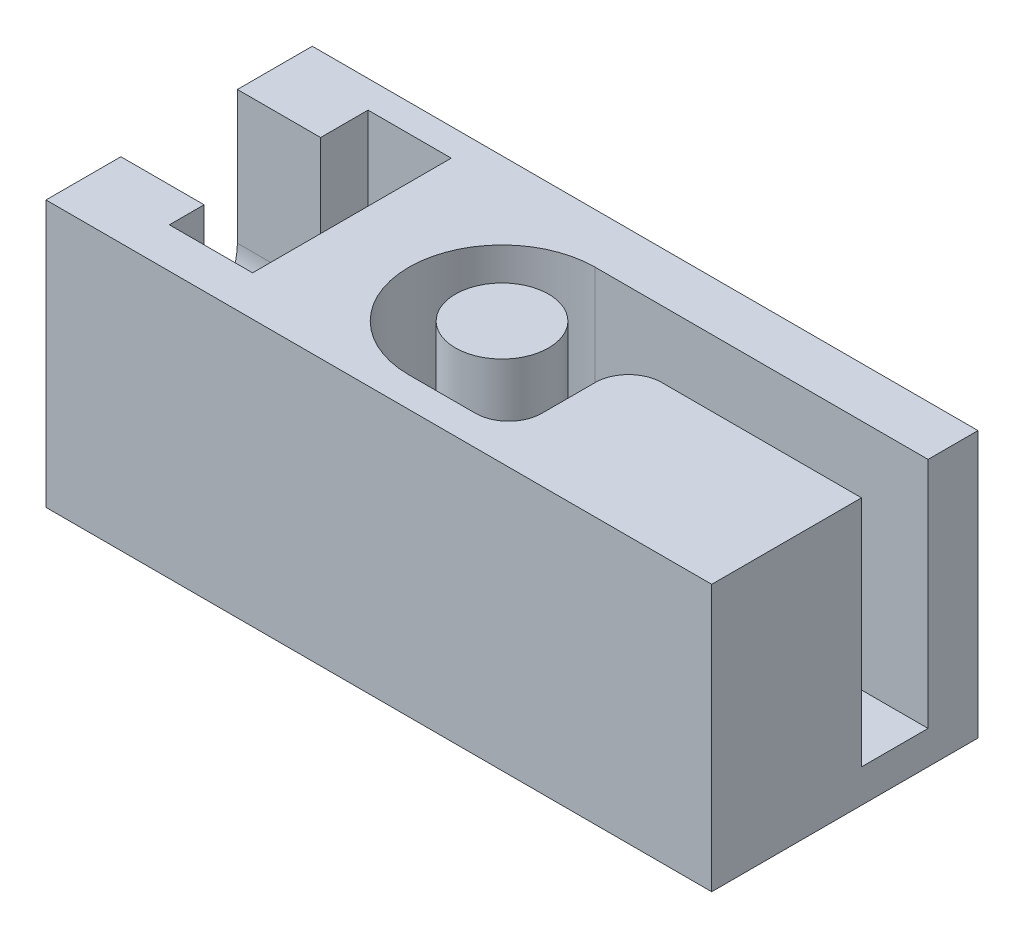
ISO-10303-21;
HEADER;
FILE_DESCRIPTION(('STEP AP214'),'2;1');
FILE_NAME('part.step','',(''),(''),'','','');
FILE_SCHEMA(('AUTOMOTIVE_DESIGN { 1 0 10303 214 1 1 1 1 }'));
ENDSEC;
DATA;
#1=APPLICATION_CONTEXT('core data for automotive mechanical design processes');
#2=APPLICATION_PROTOCOL_DEFINITION('international standard','automotive_design',2000,#1);
#3=PRODUCT_CONTEXT('',#1,'mechanical');
#4=PRODUCT('Part','Part','',(#3));
#5=PRODUCT_RELATED_PRODUCT_CATEGORY('part','',(#4));
#6=PRODUCT_DEFINITION_FORMATION('','',#4);
#7=PRODUCT_DEFINITION_CONTEXT('part definition',#1,'design');
#8=PRODUCT_DEFINITION('design','',#6,#7);
#9=PRODUCT_DEFINITION_SHAPE('','',#8);
#10=(LENGTH_UNIT() NAMED_UNIT(*) SI_UNIT(.MILLI.,.METRE.));
#11=(NAMED_UNIT(*) PLANE_ANGLE_UNIT() SI_UNIT($,.RADIAN.));
#12=(NAMED_UNIT(*) SI_UNIT($,.STERADIAN.) SOLID_ANGLE_UNIT());
#13=UNCERTAINTY_MEASURE_WITH_UNIT(LENGTH_MEASURE(1.E-05),#10,'distance_accuracy_value','');
#14=(GEOMETRIC_REPRESENTATION_CONTEXT(3) GLOBAL_UNCERTAINTY_ASSIGNED_CONTEXT((#13)) GLOBAL_UNIT_ASSIGNED_CONTEXT((#10,
#11,#12)) REPRESENTATION_CONTEXT('',''));
#15=CARTESIAN_POINT('',(0.,0.,0.));
#16=DIRECTION('',(0.,0.,1.));
#17=DIRECTION('',(1.,0.,0.));
#18=AXIS2_PLACEMENT_3D('',#15,#16,#17);
#19=CARTESIAN_POINT('',(0.,8.,0.));
#20=DIRECTION('',(0.,-1.,0.));
#21=DIRECTION('',(0.,0.,-1.));
#22=AXIS2_PLACEMENT_3D('',#19,#20,#21);
#23=PLANE('',#22);
#24=DIRECTION('',(0.,0.,1.));
#25=VECTOR('',#24,1.);
#26=CARTESIAN_POINT('',(2.5,8.,0.));
#27=LINE('',#26,#25);
#28=CARTESIAN_POINT('',(2.5,8.,-7.17542648054294));
#29=VERTEX_POINT('',#28);
#30=CARTESIAN_POINT('',(2.5,8.,-5.75));
#31=VERTEX_POINT('',#30);
#32=EDGE_CURVE('E244',#29,#31,#27,.T.);
#33=ORIENTED_EDGE('',*,*,#32,.F.);
#34=DIRECTION('',(-1.,0.,0.));
#35=VECTOR('',#34,1.);
#36=CARTESIAN_POINT('',(0.,8.,-7.17542648054294));
#37=LINE('',#36,#35);
#38=CARTESIAN_POINT('',(5.,8.,-7.17542648054294));
#39=VERTEX_POINT('',#38);
#40=EDGE_CURVE('E11',#39,#29,#37,.T.);
#41=ORIENTED_EDGE('',*,*,#40,.F.);
#42=DIRECTION('',(0.,0.,-1.));
#43=VECTOR('',#42,1.);
#44=CARTESIAN_POINT('',(5.,8.,-5.75));
#45=LINE('',#44,#43);
#46=CARTESIAN_POINT('',(5.,8.,-1.20676920104996));
#47=VERTEX_POINT('',#46);
#48=EDGE_CURVE('E246',#47,#39,#45,.T.);
#49=ORIENTED_EDGE('',*,*,#48,.F.);
#50=DIRECTION('',(1.,0.,0.));
#51=VECTOR('',#50,1.);
#52=CARTESIAN_POINT('',(0.,8.,-1.20676920104996));
#53=LINE('',#52,#51);
#54=CARTESIAN_POINT('',(2.5,8.,-1.20676920104996));
#55=VERTEX_POINT('',#54);
#56=EDGE_CURVE('E41',#55,#47,#53,.T.);
#57=ORIENTED_EDGE('',*,*,#56,.F.);
#58=CARTESIAN_POINT('',(2.5,8.,-2.25));
#59=VERTEX_POINT('',#58);
#60=EDGE_CURVE('E241',#59,#55,#27,.T.);
#61=ORIENTED_EDGE('',*,*,#60,.F.);
#62=DIRECTION('',(-1.,0.,0.));
#63=VECTOR('',#62,1.);
#64=CARTESIAN_POINT('',(5.,8.,-2.25));
#65=LINE('',#64,#63);
#66=CARTESIAN_POINT('',(0.,8.,-2.25));
#67=VERTEX_POINT('',#66);
#68=EDGE_CURVE('E263',#59,#67,#65,.T.);
#69=ORIENTED_EDGE('',*,*,#68,.T.);
#70=DIRECTION('',(0.,0.,1.));
#71=VECTOR('',#70,1.);
#72=CARTESIAN_POINT('',(0.,8.,0.));
#73=LINE('',#72,#71);
#74=CARTESIAN_POINT('',(0.,8.,0.));
#75=VERTEX_POINT('',#74);
#76=EDGE_CURVE('E85',#67,#75,#73,.T.);
#77=ORIENTED_EDGE('',*,*,#76,.T.);
#78=DIRECTION('',(1.,0.,0.));
#79=VECTOR('',#78,1.);
#80=CARTESIAN_POINT('',(0.,8.,0.));
#81=LINE('',#80,#79);
#82=CARTESIAN_POINT('',(20.,8.,0.));
#83=VERTEX_POINT('',#82);
#84=EDGE_CURVE('E333',#75,#83,#81,.T.);
#85=ORIENTED_EDGE('',*,*,#84,.T.);
#86=DIRECTION('',(0.,0.,-1.));
#87=VECTOR('',#86,1.);
#88=CARTESIAN_POINT('',(20.,8.,0.));
#89=LINE('',#88,#87);
#90=CARTESIAN_POINT('',(20.,8.,-4.5));
#91=VERTEX_POINT('',#90);
#92=EDGE_CURVE('E336',#83,#91,#89,.T.);
#93=ORIENTED_EDGE('',*,*,#92,.T.);
#94=DIRECTION('',(1.,0.,0.));
#95=VECTOR('',#94,1.);
#96=CARTESIAN_POINT('',(14.,8.,-4.5));
#97=LINE('',#96,#95);
#98=CARTESIAN_POINT('',(14.,8.,-4.5));
#99=VERTEX_POINT('',#98);
#100=EDGE_CURVE('E276',#99,#91,#97,.T.);
#101=ORIENTED_EDGE('',*,*,#100,.F.);
#102=CARTESIAN_POINT('',(14.,8.,-3.5));
#103=DIRECTION('',(0.,-1.,0.));
#104=DIRECTION('',(0.,0.,-1.));
#105=AXIS2_PLACEMENT_3D('',#102,#103,#104);
#106=CIRCLE('',#105,1.);
#107=CARTESIAN_POINT('',(13.,8.,-3.5));
#108=VERTEX_POINT('',#107);
#109=EDGE_CURVE('E310',#108,#99,#106,.T.);
#110=ORIENTED_EDGE('',*,*,#109,.F.);
#111=DIRECTION('',(0.,0.,-1.));
#112=VECTOR('',#111,1.);
#113=CARTESIAN_POINT('',(13.,8.,-1.9));
#114=LINE('',#113,#112);
#115=CARTESIAN_POINT('',(13.,8.,-1.9));
#116=VERTEX_POINT('',#115);
#117=EDGE_CURVE('E307',#116,#108,#114,.T.);
#118=ORIENTED_EDGE('',*,*,#117,.F.);
#119=CARTESIAN_POINT('',(12.,8.,-1.9));
#120=DIRECTION('',(0.,1.,0.));
#121=DIRECTION('',(0.,0.,1.));
#122=AXIS2_PLACEMENT_3D('',#119,#120,#121);
#123=CIRCLE('',#122,1.);
#124=CARTESIAN_POINT('',(12.,8.,-0.899999999999999));
#125=VERTEX_POINT('',#124);
#126=EDGE_CURVE('E304',#125,#116,#123,.T.);
#127=ORIENTED_EDGE('',*,*,#126,.F.);
#128=DIRECTION('',(1.,0.,0.));
#129=VECTOR('',#128,1.);
#130=CARTESIAN_POINT('',(10.,8.,-0.899999999999999));
#131=LINE('',#130,#129);
#132=CARTESIAN_POINT('',(10.,8.,-0.9));
#133=VERTEX_POINT('',#132);
#134=EDGE_CURVE('E301',#133,#125,#131,.T.);
#135=ORIENTED_EDGE('',*,*,#134,.F.);
#136=CARTESIAN_POINT('',(10.,8.,-3.7));
#137=DIRECTION('',(0.,1.,0.));
#138=DIRECTION('',(0.,0.,1.));
#139=AXIS2_PLACEMENT_3D('',#136,#137,#138);
#140=CIRCLE('',#139,2.8);
#141=CARTESIAN_POINT('',(10.,8.,-6.5));
#142=VERTEX_POINT('',#141);
#143=EDGE_CURVE('E298',#142,#133,#140,.T.);
#144=ORIENTED_EDGE('',*,*,#143,.F.);
#145=DIRECTION('',(-1.,0.,0.));
#146=VECTOR('',#145,1.);
#147=CARTESIAN_POINT('',(20.,8.,-6.5));
#148=LINE('',#147,#146);
#149=CARTESIAN_POINT('',(20.,8.,-6.5));
#150=VERTEX_POINT('',#149);
#151=EDGE_CURVE('E269',#150,#142,#148,.T.);
#152=ORIENTED_EDGE('',*,*,#151,.F.);
#153=CARTESIAN_POINT('',(20.,8.,-8.));
#154=VERTEX_POINT('',#153);
#155=EDGE_CURVE('E335',#150,#154,#89,.T.);
#156=ORIENTED_EDGE('',*,*,#155,.T.);
#157=DIRECTION('',(-1.,0.,0.));
#158=VECTOR('',#157,1.);
#159=CARTESIAN_POINT('',(0.,8.,-8.));
#160=LINE('',#159,#158);
#161=CARTESIAN_POINT('',(0.,8.,-8.));
#162=VERTEX_POINT('',#161);
#163=EDGE_CURVE('E57',#154,#162,#160,.T.);
#164=ORIENTED_EDGE('',*,*,#163,.T.);
#165=CARTESIAN_POINT('',(0.,8.,-5.75));
#166=VERTEX_POINT('',#165);
#167=EDGE_CURVE('E331',#162,#166,#73,.T.);
#168=ORIENTED_EDGE('',*,*,#167,.T.);
#169=DIRECTION('',(-1.,0.,0.));
#170=VECTOR('',#169,1.);
#171=CARTESIAN_POINT('',(5.,8.,-5.75));
#172=LINE('',#171,#170);
#173=EDGE_CURVE('E261',#31,#166,#172,.T.);
#174=ORIENTED_EDGE('',*,*,#173,.F.);
#175=EDGE_LOOP('',(#33,#41,#49,#57,#61,#69,#77,#85,#93,#101,#110,#118,#127,#135,#144,#152,#156,
#164,#168,#174));
#176=FACE_BOUND('',#175,.T.);
#177=ADVANCED_FACE('F33',(#176),#23,.F.);
#178=CARTESIAN_POINT('',(5.,4.,-4.));
#179=DIRECTION('',(-1.,0.,0.));
#180=DIRECTION('',(0.,0.,1.));
#181=AXIS2_PLACEMENT_3D('',#178,#179,#180);
#182=CYLINDRICAL_SURFACE('',#181,1.75);
#183=CARTESIAN_POINT('',(2.5,4.,-4.));
#184=DIRECTION('',(1.,0.,0.));
#185=DIRECTION('',(0.,0.,-1.));
#186=AXIS2_PLACEMENT_3D('',#183,#184,#185);
#187=CIRCLE('',#186,1.75);
#188=CARTESIAN_POINT('',(2.5,4.,-5.75));
#189=VERTEX_POINT('',#188);
#190=CARTESIAN_POINT('',(2.5,4.,-2.25));
#191=VERTEX_POINT('',#190);
#192=EDGE_CURVE('E209',#189,#191,#187,.F.);
#193=ORIENTED_EDGE('',*,*,#192,.F.);
#194=DIRECTION('',(-1.,0.,0.));
#195=VECTOR('',#194,1.);
#196=CARTESIAN_POINT('',(5.,4.,-5.75));
#197=LINE('',#196,#195);
#198=CARTESIAN_POINT('',(0.,4.,-5.75));
#199=VERTEX_POINT('',#198);
#200=EDGE_CURVE('E258',#189,#199,#197,.T.);
#201=ORIENTED_EDGE('',*,*,#200,.T.);
#202=CARTESIAN_POINT('',(0.,4.,-4.));
#203=DIRECTION('',(-1.,0.,0.));
#204=DIRECTION('',(0.,0.,1.));
#205=AXIS2_PLACEMENT_3D('',#202,#203,#204);
#206=CIRCLE('',#205,1.75);
#207=CARTESIAN_POINT('',(0.,4.,-2.25));
#208=VERTEX_POINT('',#207);
#209=EDGE_CURVE('E250',#199,#208,#206,.T.);
#210=ORIENTED_EDGE('',*,*,#209,.T.);
#211=DIRECTION('',(-1.,0.,0.));
#212=VECTOR('',#211,1.);
#213=CARTESIAN_POINT('',(5.,4.,-2.25));
#214=LINE('',#213,#212);
#215=EDGE_CURVE('E248',#191,#208,#214,.T.);
#216=ORIENTED_EDGE('',*,*,#215,.F.);
#217=EDGE_LOOP('',(#193,#201,#210,#216));
#218=FACE_BOUND('',#217,.T.);
#219=ADVANCED_FACE('F431',(#218),#182,.F.);
#220=CARTESIAN_POINT('',(5.,4.,-5.75));
#221=DIRECTION('',(0.,0.,-1.));
#222=DIRECTION('',(-1.,0.,0.));
#223=AXIS2_PLACEMENT_3D('',#220,#221,#222);
#224=PLANE('',#223);
#225=DIRECTION('',(0.,-1.,0.));
#226=VECTOR('',#225,1.);
#227=CARTESIAN_POINT('',(2.5,4.,-5.75));
#228=LINE('',#227,#226);
#229=EDGE_CURVE('E243',#31,#189,#228,.T.);
#230=ORIENTED_EDGE('',*,*,#229,.F.);
#231=ORIENTED_EDGE('',*,*,#173,.T.);
#232=DIRECTION('',(0.,-1.,0.));
#233=VECTOR('',#232,1.);
#234=CARTESIAN_POINT('',(0.,4.,-5.75));
#235=LINE('',#234,#233);
#236=EDGE_CURVE('E249',#166,#199,#235,.T.);
#237=ORIENTED_EDGE('',*,*,#236,.T.);
#238=ORIENTED_EDGE('',*,*,#200,.F.);
#239=EDGE_LOOP('',(#230,#231,#237,#238));
#240=FACE_BOUND('',#239,.T.);
#241=ADVANCED_FACE('F436',(#240),#224,.F.);
#242=CARTESIAN_POINT('',(5.,8.,-2.25));
#243=DIRECTION('',(0.,0.,1.));
#244=DIRECTION('',(0.,-1.,0.));
#245=AXIS2_PLACEMENT_3D('',#242,#243,#244);
#246=PLANE('',#245);
#247=DIRECTION('',(0.,1.,0.));
#248=VECTOR('',#247,1.);
#249=CARTESIAN_POINT('',(2.5,8.,-2.25));
#250=LINE('',#249,#248);
#251=EDGE_CURVE('E357',#191,#59,#250,.T.);
#252=ORIENTED_EDGE('',*,*,#251,.F.);
#253=ORIENTED_EDGE('',*,*,#215,.T.);
#254=DIRECTION('',(0.,1.,0.));
#255=VECTOR('',#254,1.);
#256=CARTESIAN_POINT('',(0.,8.,-2.25));
#257=LINE('',#256,#255);
#258=EDGE_CURVE('E253',#208,#67,#257,.T.);
#259=ORIENTED_EDGE('',*,*,#258,.T.);
#260=ORIENTED_EDGE('',*,*,#68,.F.);
#261=EDGE_LOOP('',(#252,#253,#259,#260));
#262=FACE_BOUND('',#261,.T.);
#263=ADVANCED_FACE('F376',(#262),#246,.F.);
#264=CARTESIAN_POINT('',(0.,8.,0.));
#265=DIRECTION('',(1.,0.,0.));
#266=DIRECTION('',(0.,0.,-1.));
#267=AXIS2_PLACEMENT_3D('',#264,#265,#266);
#268=PLANE('',#267);
#269=ORIENTED_EDGE('',*,*,#209,.F.);
#270=ORIENTED_EDGE('',*,*,#236,.F.);
#271=ORIENTED_EDGE('',*,*,#167,.F.);
#272=DIRECTION('',(0.,-1.,0.));
#273=VECTOR('',#272,1.);
#274=CARTESIAN_POINT('',(0.,8.,-8.));
#275=LINE('',#274,#273);
#276=CARTESIAN_POINT('',(0.,0.,-8.));
#277=VERTEX_POINT('',#276);
#278=EDGE_CURVE('E340',#162,#277,#275,.T.);
#279=ORIENTED_EDGE('',*,*,#278,.T.);
#280=DIRECTION('',(0.,0.,1.));
#281=VECTOR('',#280,1.);
#282=CARTESIAN_POINT('',(0.,0.,0.));
#283=LINE('',#282,#281);
#284=CARTESIAN_POINT('',(0.,0.,0.));
#285=VERTEX_POINT('',#284);
#286=EDGE_CURVE('E317',#277,#285,#283,.T.);
#287=ORIENTED_EDGE('',*,*,#286,.T.);
#288=DIRECTION('',(0.,-1.,0.));
#289=VECTOR('',#288,1.);
#290=CARTESIAN_POINT('',(0.,8.,0.));
#291=LINE('',#290,#289);
#292=EDGE_CURVE('E354',#75,#285,#291,.T.);
#293=ORIENTED_EDGE('',*,*,#292,.F.);
#294=ORIENTED_EDGE('',*,*,#76,.F.);
#295=ORIENTED_EDGE('',*,*,#258,.F.);
#296=EDGE_LOOP('',(#269,#270,#271,#279,#287,#293,#294,#295));
#297=FACE_BOUND('',#296,.T.);
#298=ADVANCED_FACE('F35',(#297),#268,.F.);
#299=CARTESIAN_POINT('',(0.,8.,0.));
#300=DIRECTION('',(0.,0.,-1.));
#301=DIRECTION('',(-1.,0.,0.));
#302=AXIS2_PLACEMENT_3D('',#299,#300,#301);
#303=PLANE('',#302);
#304=DIRECTION('',(1.,0.,0.));
#305=VECTOR('',#304,1.);
#306=CARTESIAN_POINT('',(0.,0.,0.));
#307=LINE('',#306,#305);
#308=CARTESIAN_POINT('',(20.,0.,0.));
#309=VERTEX_POINT('',#308);
#310=EDGE_CURVE('E343',#285,#309,#307,.T.);
#311=ORIENTED_EDGE('',*,*,#310,.T.);
#312=DIRECTION('',(0.,-1.,0.));
#313=VECTOR('',#312,1.);
#314=CARTESIAN_POINT('',(20.,8.,0.));
#315=LINE('',#314,#313);
#316=EDGE_CURVE('E351',#83,#309,#315,.T.);
#317=ORIENTED_EDGE('',*,*,#316,.F.);
#318=ORIENTED_EDGE('',*,*,#84,.F.);
#319=ORIENTED_EDGE('',*,*,#292,.T.);
#320=EDGE_LOOP('',(#311,#317,#318,#319));
#321=FACE_BOUND('',#320,.T.);
#322=ADVANCED_FACE('F384',(#321),#303,.F.);
#323=CARTESIAN_POINT('',(20.,8.,0.));
#324=DIRECTION('',(-1.,0.,0.));
#325=DIRECTION('',(0.,0.,1.));
#326=AXIS2_PLACEMENT_3D('',#323,#324,#325);
#327=PLANE('',#326);
#328=DIRECTION('',(0.,0.,-1.));
#329=VECTOR('',#328,1.);
#330=CARTESIAN_POINT('',(20.,1.,-4.5));
#331=LINE('',#330,#329);
#332=CARTESIAN_POINT('',(20.,1.,-4.5));
#333=VERTEX_POINT('',#332);
#334=CARTESIAN_POINT('',(20.,1.,-6.5));
#335=VERTEX_POINT('',#334);
#336=EDGE_CURVE('E272',#333,#335,#331,.T.);
#337=ORIENTED_EDGE('',*,*,#336,.F.);
#338=DIRECTION('',(0.,1.,0.));
#339=VECTOR('',#338,1.);
#340=CARTESIAN_POINT('',(20.,1.,-4.5));
#341=LINE('',#340,#339);
#342=EDGE_CURVE('E314',#333,#91,#341,.T.);
#343=ORIENTED_EDGE('',*,*,#342,.T.);
#344=ORIENTED_EDGE('',*,*,#92,.F.);
#345=ORIENTED_EDGE('',*,*,#316,.T.);
#346=DIRECTION('',(0.,0.,-1.));
#347=VECTOR('',#346,1.);
#348=CARTESIAN_POINT('',(20.,0.,0.));
#349=LINE('',#348,#347);
#350=CARTESIAN_POINT('',(20.,0.,-8.));
#351=VERTEX_POINT('',#350);
#352=EDGE_CURVE('E345',#309,#351,#349,.T.);
#353=ORIENTED_EDGE('',*,*,#352,.T.);
#354=DIRECTION('',(0.,-1.,0.));
#355=VECTOR('',#354,1.);
#356=CARTESIAN_POINT('',(20.,8.,-8.));
#357=LINE('',#356,#355);
#358=EDGE_CURVE('E349',#154,#351,#357,.T.);
#359=ORIENTED_EDGE('',*,*,#358,.F.);
#360=ORIENTED_EDGE('',*,*,#155,.F.);
#361=DIRECTION('',(0.,1.,0.));
#362=VECTOR('',#361,1.);
#363=CARTESIAN_POINT('',(20.,1.,-6.5));
#364=LINE('',#363,#362);
#365=EDGE_CURVE('E48',#335,#150,#364,.T.);
#366=ORIENTED_EDGE('',*,*,#365,.F.);
#367=EDGE_LOOP('',(#337,#343,#344,#345,#353,#359,#360,#366));
#368=FACE_BOUND('',#367,.T.);
#369=ADVANCED_FACE('F391',(#368),#327,.F.);
#370=CARTESIAN_POINT('',(0.,8.,-8.));
#371=DIRECTION('',(0.,0.,1.));
#372=DIRECTION('',(1.,0.,0.));
#373=AXIS2_PLACEMENT_3D('',#370,#371,#372);
#374=PLANE('',#373);
#375=DIRECTION('',(-1.,0.,0.));
#376=VECTOR('',#375,1.);
#377=CARTESIAN_POINT('',(0.,0.,-8.));
#378=LINE('',#377,#376);
#379=EDGE_CURVE('E78',#351,#277,#378,.T.);
#380=ORIENTED_EDGE('',*,*,#379,.T.);
#381=ORIENTED_EDGE('',*,*,#278,.F.);
#382=ORIENTED_EDGE('',*,*,#163,.F.);
#383=ORIENTED_EDGE('',*,*,#358,.T.);
#384=EDGE_LOOP('',(#380,#381,#382,#383));
#385=FACE_BOUND('',#384,.T.);
#386=ADVANCED_FACE('F599',(#385),#374,.F.);
#387=CARTESIAN_POINT('',(0.,0.,0.));
#388=DIRECTION('',(0.,-1.,0.));
#389=DIRECTION('',(0.,0.,-1.));
#390=AXIS2_PLACEMENT_3D('',#387,#388,#389);
#391=PLANE('',#390);
#392=ORIENTED_EDGE('',*,*,#286,.F.);
#393=ORIENTED_EDGE('',*,*,#379,.F.);
#394=ORIENTED_EDGE('',*,*,#352,.F.);
#395=ORIENTED_EDGE('',*,*,#310,.F.);
#396=EDGE_LOOP('',(#392,#393,#394,#395));
#397=FACE_BOUND('',#396,.T.);
#398=ADVANCED_FACE('F457',(#397),#391,.T.);
#399=CARTESIAN_POINT('',(14.,1.,-4.5));
#400=DIRECTION('',(0.,0.,1.));
#401=DIRECTION('',(1.,0.,0.));
#402=AXIS2_PLACEMENT_3D('',#399,#400,#401);
#403=PLANE('',#402);
#404=ORIENTED_EDGE('',*,*,#100,.T.);
#405=ORIENTED_EDGE('',*,*,#342,.F.);
#406=DIRECTION('',(1.,0.,0.));
#407=VECTOR('',#406,1.);
#408=CARTESIAN_POINT('',(14.,1.,-4.5));
#409=LINE('',#408,#407);
#410=CARTESIAN_POINT('',(14.,1.,-4.5));
#411=VERTEX_POINT('',#410);
#412=EDGE_CURVE('E294',#411,#333,#409,.T.);
#413=ORIENTED_EDGE('',*,*,#412,.F.);
#414=DIRECTION('',(0.,1.,0.));
#415=VECTOR('',#414,1.);
#416=CARTESIAN_POINT('',(14.,1.,-4.5));
#417=LINE('',#416,#415);
#418=EDGE_CURVE('E318',#411,#99,#417,.T.);
#419=ORIENTED_EDGE('',*,*,#418,.T.);
#420=EDGE_LOOP('',(#404,#405,#413,#419));
#421=FACE_BOUND('',#420,.T.);
#422=ADVANCED_FACE('F395',(#421),#403,.F.);
#423=CARTESIAN_POINT('',(14.,1.,-3.5));
#424=DIRECTION('',(0.,1.,0.));
#425=DIRECTION('',(0.,0.,1.));
#426=AXIS2_PLACEMENT_3D('',#423,#424,#425);
#427=CYLINDRICAL_SURFACE('',#426,1.);
#428=ORIENTED_EDGE('',*,*,#109,.T.);
#429=ORIENTED_EDGE('',*,*,#418,.F.);
#430=CARTESIAN_POINT('',(14.,1.,-3.5));
#431=DIRECTION('',(0.,-1.,0.));
#432=DIRECTION('',(0.,0.,-1.));
#433=AXIS2_PLACEMENT_3D('',#430,#431,#432);
#434=CIRCLE('',#433,1.);
#435=CARTESIAN_POINT('',(13.,1.,-3.5));
#436=VERTEX_POINT('',#435);
#437=EDGE_CURVE('E291',#436,#411,#434,.T.);
#438=ORIENTED_EDGE('',*,*,#437,.F.);
#439=DIRECTION('',(0.,1.,0.));
#440=VECTOR('',#439,1.);
#441=CARTESIAN_POINT('',(13.,1.,-3.5));
#442=LINE('',#441,#440);
#443=EDGE_CURVE('E320',#436,#108,#442,.T.);
#444=ORIENTED_EDGE('',*,*,#443,.T.);
#445=EDGE_LOOP('',(#428,#429,#438,#444));
#446=FACE_BOUND('',#445,.T.);
#447=ADVANCED_FACE('F401',(#446),#427,.T.);
#448=CARTESIAN_POINT('',(13.,1.,-1.9));
#449=DIRECTION('',(1.,0.,0.));
#450=DIRECTION('',(0.,0.,-1.));
#451=AXIS2_PLACEMENT_3D('',#448,#449,#450);
#452=PLANE('',#451);
#453=ORIENTED_EDGE('',*,*,#117,.T.);
#454=ORIENTED_EDGE('',*,*,#443,.F.);
#455=DIRECTION('',(0.,0.,-1.));
#456=VECTOR('',#455,1.);
#457=CARTESIAN_POINT('',(13.,1.,-1.9));
#458=LINE('',#457,#456);
#459=CARTESIAN_POINT('',(13.,1.,-1.9));
#460=VERTEX_POINT('',#459);
#461=EDGE_CURVE('E288',#460,#436,#458,.T.);
#462=ORIENTED_EDGE('',*,*,#461,.F.);
#463=DIRECTION('',(0.,1.,0.));
#464=VECTOR('',#463,1.);
#465=CARTESIAN_POINT('',(13.,1.,-1.9));
#466=LINE('',#465,#464);
#467=EDGE_CURVE('E322',#460,#116,#466,.T.);
#468=ORIENTED_EDGE('',*,*,#467,.T.);
#469=EDGE_LOOP('',(#453,#454,#462,#468));
#470=FACE_BOUND('',#469,.T.);
#471=ADVANCED_FACE('F406',(#470),#452,.F.);
#472=CARTESIAN_POINT('',(12.,1.,-1.9));
#473=DIRECTION('',(0.,1.,0.));
#474=DIRECTION('',(0.,0.,1.));
#475=AXIS2_PLACEMENT_3D('',#472,#473,#474);
#476=CYLINDRICAL_SURFACE('',#475,1.);
#477=ORIENTED_EDGE('',*,*,#126,.T.);
#478=ORIENTED_EDGE('',*,*,#467,.F.);
#479=CARTESIAN_POINT('',(12.,1.,-1.9));
#480=DIRECTION('',(0.,1.,0.));
#481=DIRECTION('',(0.,0.,1.));
#482=AXIS2_PLACEMENT_3D('',#479,#480,#481);
#483=CIRCLE('',#482,1.);
#484=CARTESIAN_POINT('',(12.,1.,-0.899999999999999));
#485=VERTEX_POINT('',#484);
#486=EDGE_CURVE('E285',#485,#460,#483,.T.);
#487=ORIENTED_EDGE('',*,*,#486,.F.);
#488=DIRECTION('',(0.,1.,0.));
#489=VECTOR('',#488,1.);
#490=CARTESIAN_POINT('',(12.,1.,-0.899999999999999));
#491=LINE('',#490,#489);
#492=EDGE_CURVE('E324',#485,#125,#491,.T.);
#493=ORIENTED_EDGE('',*,*,#492,.T.);
#494=EDGE_LOOP('',(#477,#478,#487,#493));
#495=FACE_BOUND('',#494,.T.);
#496=ADVANCED_FACE('F409',(#495),#476,.F.);
#497=CARTESIAN_POINT('',(10.,1.,-0.899999999999999));
#498=DIRECTION('',(0.,0.,1.));
#499=DIRECTION('',(1.,0.,0.));
#500=AXIS2_PLACEMENT_3D('',#497,#498,#499);
#501=PLANE('',#500);
#502=ORIENTED_EDGE('',*,*,#134,.T.);
#503=ORIENTED_EDGE('',*,*,#492,.F.);
#504=DIRECTION('',(1.,0.,0.));
#505=VECTOR('',#504,1.);
#506=CARTESIAN_POINT('',(10.,1.,-0.899999999999999));
#507=LINE('',#506,#505);
#508=CARTESIAN_POINT('',(10.,1.,-0.9));
#509=VERTEX_POINT('',#508);
#510=EDGE_CURVE('E282',#509,#485,#507,.T.);
#511=ORIENTED_EDGE('',*,*,#510,.F.);
#512=DIRECTION('',(0.,1.,0.));
#513=VECTOR('',#512,1.);
#514=CARTESIAN_POINT('',(10.,1.,-0.9));
#515=LINE('',#514,#513);
#516=EDGE_CURVE('E326',#509,#133,#515,.T.);
#517=ORIENTED_EDGE('',*,*,#516,.T.);
#518=EDGE_LOOP('',(#502,#503,#511,#517));
#519=FACE_BOUND('',#518,.T.);
#520=ADVANCED_FACE('F412',(#519),#501,.F.);
#521=CARTESIAN_POINT('',(10.,1.,-3.7));
#522=DIRECTION('',(0.,1.,0.));
#523=DIRECTION('',(0.,0.,1.));
#524=AXIS2_PLACEMENT_3D('',#521,#522,#523);
#525=CYLINDRICAL_SURFACE('',#524,2.8);
#526=ORIENTED_EDGE('',*,*,#143,.T.);
#527=ORIENTED_EDGE('',*,*,#516,.F.);
#528=CARTESIAN_POINT('',(10.,1.,-3.7));
#529=DIRECTION('',(0.,1.,0.));
#530=DIRECTION('',(0.,0.,1.));
#531=AXIS2_PLACEMENT_3D('',#528,#529,#530);
#532=CIRCLE('',#531,2.8);
#533=CARTESIAN_POINT('',(10.,1.,-6.5));
#534=VERTEX_POINT('',#533);
#535=EDGE_CURVE('E279',#534,#509,#532,.T.);
#536=ORIENTED_EDGE('',*,*,#535,.F.);
#537=DIRECTION('',(0.,1.,0.));
#538=VECTOR('',#537,1.);
#539=CARTESIAN_POINT('',(10.,1.,-6.5));
#540=LINE('',#539,#538);
#541=EDGE_CURVE('E328',#534,#142,#540,.T.);
#542=ORIENTED_EDGE('',*,*,#541,.T.);
#543=EDGE_LOOP('',(#526,#527,#536,#542));
#544=FACE_BOUND('',#543,.T.);
#545=ADVANCED_FACE('F416',(#544),#525,.F.);
#546=CARTESIAN_POINT('',(20.,1.,-6.5));
#547=DIRECTION('',(0.,0.,-1.));
#548=DIRECTION('',(-1.,0.,0.));
#549=AXIS2_PLACEMENT_3D('',#546,#547,#548);
#550=PLANE('',#549);
#551=ORIENTED_EDGE('',*,*,#151,.T.);
#552=ORIENTED_EDGE('',*,*,#541,.F.);
#553=DIRECTION('',(-1.,0.,0.));
#554=VECTOR('',#553,1.);
#555=CARTESIAN_POINT('',(20.,1.,-6.5));
#556=LINE('',#555,#554);
#557=EDGE_CURVE('E275',#335,#534,#556,.T.);
#558=ORIENTED_EDGE('',*,*,#557,.F.);
#559=ORIENTED_EDGE('',*,*,#365,.T.);
#560=EDGE_LOOP('',(#551,#552,#558,#559));
#561=FACE_BOUND('',#560,.T.);
#562=ADVANCED_FACE('F418',(#561),#550,.F.);
#563=CARTESIAN_POINT('',(10.,1.,-3.7));
#564=DIRECTION('',(0.,1.,0.));
#565=DIRECTION('',(0.,0.,1.));
#566=AXIS2_PLACEMENT_3D('',#563,#564,#565);
#567=PLANE('',#566);
#568=CARTESIAN_POINT('',(10.,1.,-3.7));
#569=DIRECTION('',(0.,1.,0.));
#570=DIRECTION('',(0.,0.,1.));
#571=AXIS2_PLACEMENT_3D('',#568,#569,#570);
#572=CIRCLE('',#571,1.4);
#573=CARTESIAN_POINT('',(10.,1.,-2.3));
#574=VERTEX_POINT('',#573);
#575=EDGE_CURVE('E266',#574,#574,#572,.T.);
#576=ORIENTED_EDGE('',*,*,#575,.F.);
#577=EDGE_LOOP('',(#576));
#578=FACE_BOUND('',#577,.T.);
#579=ORIENTED_EDGE('',*,*,#336,.T.);
#580=ORIENTED_EDGE('',*,*,#557,.T.);
#581=ORIENTED_EDGE('',*,*,#535,.T.);
#582=ORIENTED_EDGE('',*,*,#510,.T.);
#583=ORIENTED_EDGE('',*,*,#486,.T.);
#584=ORIENTED_EDGE('',*,*,#461,.T.);
#585=ORIENTED_EDGE('',*,*,#437,.T.);
#586=ORIENTED_EDGE('',*,*,#412,.T.);
#587=EDGE_LOOP('',(#579,#580,#581,#582,#583,#584,#585,#586));
#588=FACE_BOUND('',#587,.T.);
#589=ADVANCED_FACE('F397',(#578,#588),#567,.T.);
#590=CARTESIAN_POINT('',(10.,1.,-3.7));
#591=DIRECTION('',(0.,1.,0.));
#592=DIRECTION('',(0.,0.,1.));
#593=AXIS2_PLACEMENT_3D('',#590,#591,#592);
#594=CYLINDRICAL_SURFACE('',#593,1.4);
#595=ORIENTED_EDGE('',*,*,#575,.T.);
#596=EDGE_LOOP('',(#595));
#597=FACE_BOUND('',#596,.T.);
#598=CARTESIAN_POINT('',(10.,8.,-3.7));
#599=DIRECTION('',(0.,1.,0.));
#600=DIRECTION('',(0.,0.,1.));
#601=AXIS2_PLACEMENT_3D('',#598,#599,#600);
#602=CIRCLE('',#601,1.4);
#603=CARTESIAN_POINT('',(10.,8.,-2.3));
#604=VERTEX_POINT('',#603);
#605=EDGE_CURVE('E260',#604,#604,#602,.T.);
#606=ORIENTED_EDGE('',*,*,#605,.F.);
#607=EDGE_LOOP('',(#606));
#608=FACE_BOUND('',#607,.T.);
#609=ADVANCED_FACE('F425',(#597,#608),#594,.T.);
#610=ORIENTED_EDGE('',*,*,#605,.T.);
#611=EDGE_LOOP('',(#610));
#612=FACE_BOUND('',#611,.T.);
#613=ADVANCED_FACE('F432',(#612),#23,.F.);
#614=CARTESIAN_POINT('',(5.,4.,-4.));
#615=DIRECTION('',(-1.,0.,0.));
#616=DIRECTION('',(0.,0.,1.));
#617=AXIS2_PLACEMENT_3D('',#614,#615,#616);
#618=PLANE('',#617);
#619=ORIENTED_EDGE('',*,*,#48,.T.);
#620=DIRECTION('',(0.,-1.,0.));
#621=VECTOR('',#620,1.);
#622=CARTESIAN_POINT('',(5.,3.5,-7.17542648054294));
#623=LINE('',#622,#621);
#624=CARTESIAN_POINT('',(5.,3.5,-7.17542648054294));
#625=VERTEX_POINT('',#624);
#626=EDGE_CURVE('E225',#39,#625,#623,.T.);
#627=ORIENTED_EDGE('',*,*,#626,.T.);
#628=DIRECTION('',(0.,-0.764528884517725,0.644589469924914));
#629=VECTOR('',#628,1.);
#630=CARTESIAN_POINT('',(5.,3.5,-7.17542648054294));
#631=LINE('',#630,#629);
#632=CARTESIAN_POINT('',(5.,1.01352632518771,-5.07903119648439));
#633=VERTEX_POINT('',#632);
#634=EDGE_CURVE('E208',#625,#633,#631,.T.);
#635=ORIENTED_EDGE('',*,*,#634,.T.);
#636=DIRECTION('',(0.,0.175966413708059,0.984396170881787));
#637=VECTOR('',#636,1.);
#638=CARTESIAN_POINT('',(5.,1.01352632518771,-5.07903119648439));
#639=LINE('',#638,#637);
#640=CARTESIAN_POINT('',(5.,1.57229473496246,-1.95315352812129));
#641=VERTEX_POINT('',#640);
#642=EDGE_CURVE('E228',#633,#641,#639,.T.);
#643=ORIENTED_EDGE('',*,*,#642,.T.);
#644=DIRECTION('',(0.,0.940495298225784,0.339806700956873));
#645=VECTOR('',#644,1.);
#646=CARTESIAN_POINT('',(5.,1.57229473496246,-1.95315352812129));
#647=LINE('',#646,#645);
#648=CARTESIAN_POINT('',(5.,3.63808963630871,-1.20676920104996));
#649=VERTEX_POINT('',#648);
#650=EDGE_CURVE('E230',#641,#649,#647,.T.);
#651=ORIENTED_EDGE('',*,*,#650,.T.);
#652=DIRECTION('',(0.,1.,0.));
#653=VECTOR('',#652,1.);
#654=CARTESIAN_POINT('',(5.,3.63808963630871,-1.20676920104996));
#655=LINE('',#654,#653);
#656=EDGE_CURVE('E202',#649,#47,#655,.T.);
#657=ORIENTED_EDGE('',*,*,#656,.T.);
#658=EDGE_LOOP('',(#619,#627,#635,#643,#651,#657));
#659=FACE_BOUND('',#658,.T.);
#660=ADVANCED_FACE('F367',(#659),#618,.T.);
#661=CARTESIAN_POINT('',(2.5,3.5,-7.17542648054294));
#662=DIRECTION('',(0.,0.,1.));
#663=DIRECTION('',(1.,0.,0.));
#664=AXIS2_PLACEMENT_3D('',#661,#662,#663);
#665=PLANE('',#664);
#666=ORIENTED_EDGE('',*,*,#40,.T.);
#667=DIRECTION('',(0.,-1.,0.));
#668=VECTOR('',#667,1.);
#669=CARTESIAN_POINT('',(2.5,3.5,-7.17542648054294));
#670=LINE('',#669,#668);
#671=CARTESIAN_POINT('',(2.5,3.5,-7.17542648054294));
#672=VERTEX_POINT('',#671);
#673=EDGE_CURVE('E191',#29,#672,#670,.T.);
#674=ORIENTED_EDGE('',*,*,#673,.T.);
#675=DIRECTION('',(1.,0.,0.));
#676=VECTOR('',#675,1.);
#677=CARTESIAN_POINT('',(2.5,3.5,-7.17542648054294));
#678=LINE('',#677,#676);
#679=EDGE_CURVE('E195',#672,#625,#678,.T.);
#680=ORIENTED_EDGE('',*,*,#679,.T.);
#681=ORIENTED_EDGE('',*,*,#626,.F.);
#682=EDGE_LOOP('',(#666,#674,#680,#681));
#683=FACE_BOUND('',#682,.T.);
#684=ADVANCED_FACE('F193',(#683),#665,.T.);
#685=CARTESIAN_POINT('',(2.5,3.63808963630871,-1.20676920104996));
#686=DIRECTION('',(0.,0.,-1.));
#687=DIRECTION('',(-1.,0.,0.));
#688=AXIS2_PLACEMENT_3D('',#685,#686,#687);
#689=PLANE('',#688);
#690=ORIENTED_EDGE('',*,*,#56,.T.);
#691=ORIENTED_EDGE('',*,*,#656,.F.);
#692=DIRECTION('',(1.,0.,0.));
#693=VECTOR('',#692,1.);
#694=CARTESIAN_POINT('',(2.5,3.63808963630871,-1.20676920104996));
#695=LINE('',#694,#693);
#696=CARTESIAN_POINT('',(2.5,3.63808963630871,-1.20676920104996));
#697=VERTEX_POINT('',#696);
#698=EDGE_CURVE('E224',#697,#649,#695,.T.);
#699=ORIENTED_EDGE('',*,*,#698,.F.);
#700=DIRECTION('',(0.,1.,0.));
#701=VECTOR('',#700,1.);
#702=CARTESIAN_POINT('',(2.5,3.63808963630871,-1.20676920104996));
#703=LINE('',#702,#701);
#704=EDGE_CURVE('E221',#697,#55,#703,.T.);
#705=ORIENTED_EDGE('',*,*,#704,.T.);
#706=EDGE_LOOP('',(#690,#691,#699,#705));
#707=FACE_BOUND('',#706,.T.);
#708=ADVANCED_FACE('F362',(#707),#689,.T.);
#709=CARTESIAN_POINT('',(2.5,0.,0.));
#710=DIRECTION('',(1.,0.,0.));
#711=DIRECTION('',(0.,0.,-1.));
#712=AXIS2_PLACEMENT_3D('',#709,#710,#711);
#713=PLANE('',#712);
#714=ORIENTED_EDGE('',*,*,#32,.T.);
#715=ORIENTED_EDGE('',*,*,#229,.T.);
#716=ORIENTED_EDGE('',*,*,#192,.T.);
#717=ORIENTED_EDGE('',*,*,#251,.T.);
#718=ORIENTED_EDGE('',*,*,#60,.T.);
#719=ORIENTED_EDGE('',*,*,#704,.F.);
#720=DIRECTION('',(0.,0.940495298225784,0.339806700956873));
#721=VECTOR('',#720,1.);
#722=CARTESIAN_POINT('',(2.5,1.57229473496246,-1.95315352812129));
#723=LINE('',#722,#721);
#724=CARTESIAN_POINT('',(2.5,1.57229473496246,-1.95315352812129));
#725=VERTEX_POINT('',#724);
#726=EDGE_CURVE('E217',#725,#697,#723,.T.);
#727=ORIENTED_EDGE('',*,*,#726,.F.);
#728=DIRECTION('',(0.,0.175966413708059,0.984396170881787));
#729=VECTOR('',#728,1.);
#730=CARTESIAN_POINT('',(2.5,1.01352632518771,-5.07903119648439));
#731=LINE('',#730,#729);
#732=CARTESIAN_POINT('',(2.5,1.01352632518771,-5.07903119648439));
#733=VERTEX_POINT('',#732);
#734=EDGE_CURVE('E215',#733,#725,#731,.T.);
#735=ORIENTED_EDGE('',*,*,#734,.F.);
#736=DIRECTION('',(0.,-0.764528884517725,0.644589469924914));
#737=VECTOR('',#736,1.);
#738=CARTESIAN_POINT('',(2.5,3.5,-7.17542648054294));
#739=LINE('',#738,#737);
#740=EDGE_CURVE('E201',#672,#733,#739,.T.);
#741=ORIENTED_EDGE('',*,*,#740,.F.);
#742=ORIENTED_EDGE('',*,*,#673,.F.);
#743=EDGE_LOOP('',(#714,#715,#716,#717,#718,#719,#727,#735,#741,#742));
#744=FACE_BOUND('',#743,.T.);
#745=ADVANCED_FACE('F213',(#744),#713,.T.);
#746=CARTESIAN_POINT('',(2.5,3.5,-7.17542648054294));
#747=DIRECTION('',(0.,0.644589469924914,0.764528884517726));
#748=DIRECTION('',(0.,-0.764528884517726,0.644589469924914));
#749=AXIS2_PLACEMENT_3D('',#746,#747,#748);
#750=PLANE('',#749);
#751=ORIENTED_EDGE('',*,*,#634,.F.);
#752=ORIENTED_EDGE('',*,*,#679,.F.);
#753=ORIENTED_EDGE('',*,*,#740,.T.);
#754=DIRECTION('',(1.,0.,0.));
#755=VECTOR('',#754,1.);
#756=CARTESIAN_POINT('',(2.5,1.01352632518771,-5.07903119648439));
#757=LINE('',#756,#755);
#758=EDGE_CURVE('E210',#733,#633,#757,.T.);
#759=ORIENTED_EDGE('',*,*,#758,.T.);
#760=EDGE_LOOP('',(#751,#752,#753,#759));
#761=FACE_BOUND('',#760,.T.);
#762=ADVANCED_FACE('F205',(#761),#750,.T.);
#763=CARTESIAN_POINT('',(2.5,1.01352632518771,-5.07903119648439));
#764=DIRECTION('',(0.,0.984396170881787,-0.175966413708059));
#765=DIRECTION('',(0.,0.175966413708059,0.984396170881787));
#766=AXIS2_PLACEMENT_3D('',#763,#764,#765);
#767=PLANE('',#766);
#768=ORIENTED_EDGE('',*,*,#642,.F.);
#769=ORIENTED_EDGE('',*,*,#758,.F.);
#770=ORIENTED_EDGE('',*,*,#734,.T.);
#771=DIRECTION('',(1.,0.,0.));
#772=VECTOR('',#771,1.);
#773=CARTESIAN_POINT('',(2.5,1.57229473496246,-1.95315352812129));
#774=LINE('',#773,#772);
#775=EDGE_CURVE('E236',#725,#641,#774,.T.);
#776=ORIENTED_EDGE('',*,*,#775,.T.);
#777=EDGE_LOOP('',(#768,#769,#770,#776));
#778=FACE_BOUND('',#777,.T.);
#779=ADVANCED_FACE('F568',(#778),#767,.T.);
#780=CARTESIAN_POINT('',(2.5,1.57229473496246,-1.95315352812129));
#781=DIRECTION('',(0.,0.339806700956873,-0.940495298225784));
#782=DIRECTION('',(0.,0.940495298225784,0.339806700956873));
#783=AXIS2_PLACEMENT_3D('',#780,#781,#782);
#784=PLANE('',#783);
#785=ORIENTED_EDGE('',*,*,#650,.F.);
#786=ORIENTED_EDGE('',*,*,#775,.F.);
#787=ORIENTED_EDGE('',*,*,#726,.T.);
#788=ORIENTED_EDGE('',*,*,#698,.T.);
#789=EDGE_LOOP('',(#785,#786,#787,#788));
#790=FACE_BOUND('',#789,.T.);
#791=ADVANCED_FACE('F372',(#790),#784,.T.);
#792=CLOSED_SHELL('',(#177,#219,#241,#263,#298,#322,#369,#386,#398,#422,#447,#471,#496,#520,
#545,#562,#589,#609,#613,#660,#684,#708,#745,#762,#779,#791));
#793=MANIFOLD_SOLID_BREP('B2',#792);
#794=ADVANCED_BREP_SHAPE_REPRESENTATION('',(#18,#793),#14);
#795=SHAPE_DEFINITION_REPRESENTATION(#9,#794);
ENDSEC;
END-ISO-10303-21;
